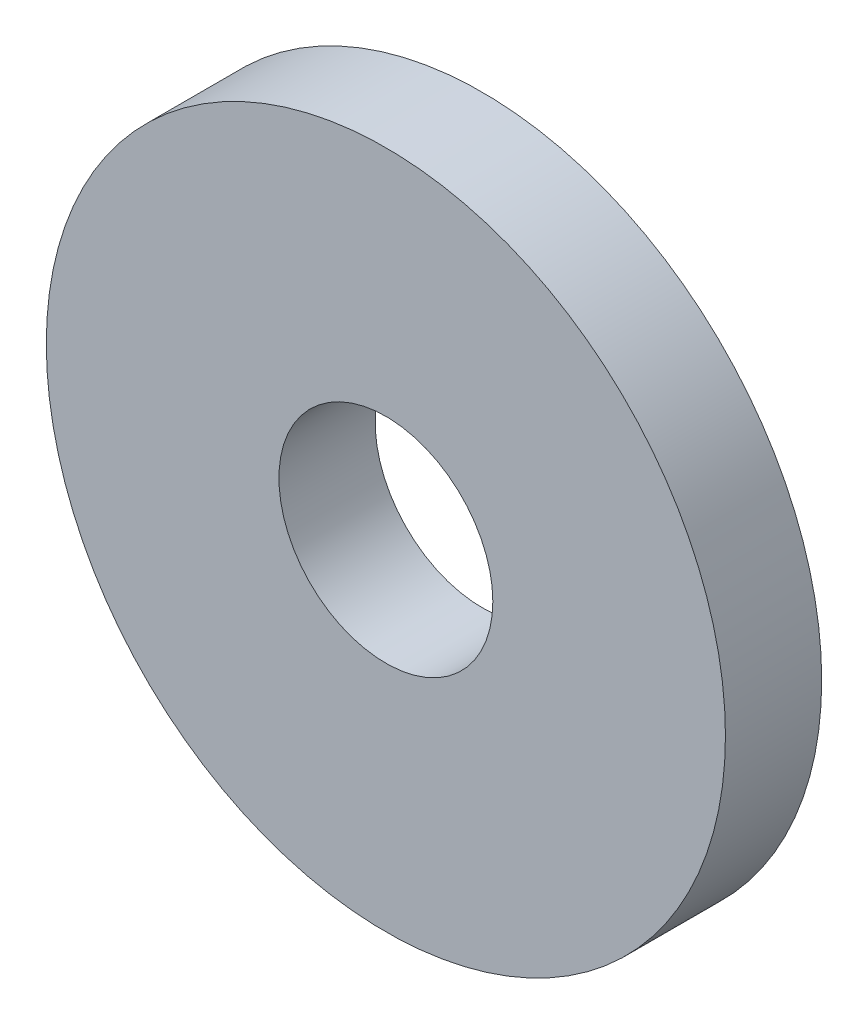
ISO-10303-21;
HEADER;
FILE_DESCRIPTION(('STEP AP214'),'2;1');
FILE_NAME('part.step','',(''),(''),'','','');
FILE_SCHEMA(('AUTOMOTIVE_DESIGN { 1 0 10303 214 1 1 1 1 }'));
ENDSEC;
DATA;
#1=APPLICATION_CONTEXT('core data for automotive mechanical design processes');
#2=APPLICATION_PROTOCOL_DEFINITION('international standard','automotive_design',2000,#1);
#3=PRODUCT_CONTEXT('',#1,'mechanical');
#4=PRODUCT('Part','Part','',(#3));
#5=PRODUCT_RELATED_PRODUCT_CATEGORY('part','',(#4));
#6=PRODUCT_DEFINITION_FORMATION('','',#4);
#7=PRODUCT_DEFINITION_CONTEXT('part definition',#1,'design');
#8=PRODUCT_DEFINITION('design','',#6,#7);
#9=PRODUCT_DEFINITION_SHAPE('','',#8);
#10=(LENGTH_UNIT() NAMED_UNIT(*) SI_UNIT(.MILLI.,.METRE.));
#11=(NAMED_UNIT(*) PLANE_ANGLE_UNIT() SI_UNIT($,.RADIAN.));
#12=(NAMED_UNIT(*) SI_UNIT($,.STERADIAN.) SOLID_ANGLE_UNIT());
#13=UNCERTAINTY_MEASURE_WITH_UNIT(LENGTH_MEASURE(1.E-05),#10,'distance_accuracy_value','');
#14=(GEOMETRIC_REPRESENTATION_CONTEXT(3) GLOBAL_UNCERTAINTY_ASSIGNED_CONTEXT((#13)) GLOBAL_UNIT_ASSIGNED_CONTEXT((#10,
#11,#12)) REPRESENTATION_CONTEXT('',''));
#15=CARTESIAN_POINT('',(0.,0.,0.));
#16=DIRECTION('',(0.,0.,1.));
#17=DIRECTION('',(1.,0.,0.));
#18=AXIS2_PLACEMENT_3D('',#15,#16,#17);
#19=CARTESIAN_POINT('',(0.,0.,2.25));
#20=DIRECTION('',(0.,0.,1.));
#21=DIRECTION('',(1.,0.,0.));
#22=AXIS2_PLACEMENT_3D('',#19,#20,#21);
#23=PLANE('',#22);
#24=CARTESIAN_POINT('',(0.,0.,2.25));
#25=DIRECTION('',(0.,0.,1.));
#26=DIRECTION('',(1.,0.,0.));
#27=AXIS2_PLACEMENT_3D('',#24,#25,#26);
#28=CIRCLE('',#27,15.875);
#29=CARTESIAN_POINT('',(15.875,0.,2.25));
#30=VERTEX_POINT('',#29);
#31=EDGE_CURVE('E10',#30,#30,#28,.T.);
#32=ORIENTED_EDGE('',*,*,#31,.T.);
#33=EDGE_LOOP('',(#32));
#34=FACE_BOUND('',#33,.T.);
#35=CARTESIAN_POINT('',(0.,0.,2.25));
#36=DIRECTION('',(0.,0.,1.));
#37=DIRECTION('',(1.,0.,0.));
#38=AXIS2_PLACEMENT_3D('',#35,#36,#37);
#39=CIRCLE('',#38,5.);
#40=CARTESIAN_POINT('',(5.,0.,2.25));
#41=VERTEX_POINT('',#40);
#42=EDGE_CURVE('E42',#41,#41,#39,.T.);
#43=ORIENTED_EDGE('',*,*,#42,.F.);
#44=EDGE_LOOP('',(#43));
#45=FACE_BOUND('',#44,.T.);
#46=ADVANCED_FACE('F31',(#34,#45),#23,.T.);
#47=CARTESIAN_POINT('',(0.,0.,-2.25));
#48=DIRECTION('',(0.,0.,1.));
#49=DIRECTION('',(1.,0.,0.));
#50=AXIS2_PLACEMENT_3D('',#47,#48,#49);
#51=PLANE('',#50);
#52=CARTESIAN_POINT('',(0.,0.,-2.25));
#53=DIRECTION('',(0.,0.,1.));
#54=DIRECTION('',(1.,0.,0.));
#55=AXIS2_PLACEMENT_3D('',#52,#53,#54);
#56=CIRCLE('',#55,15.875);
#57=CARTESIAN_POINT('',(15.875,0.,-2.25));
#58=VERTEX_POINT('',#57);
#59=EDGE_CURVE('E35',#58,#58,#56,.T.);
#60=ORIENTED_EDGE('',*,*,#59,.F.);
#61=EDGE_LOOP('',(#60));
#62=FACE_BOUND('',#61,.T.);
#63=CARTESIAN_POINT('',(0.,0.,-2.25));
#64=DIRECTION('',(0.,0.,1.));
#65=DIRECTION('',(1.,0.,0.));
#66=AXIS2_PLACEMENT_3D('',#63,#64,#65);
#67=CIRCLE('',#66,5.);
#68=CARTESIAN_POINT('',(5.,0.,-2.25));
#69=VERTEX_POINT('',#68);
#70=EDGE_CURVE('E44',#69,#69,#67,.T.);
#71=ORIENTED_EDGE('',*,*,#70,.T.);
#72=EDGE_LOOP('',(#71));
#73=FACE_BOUND('',#72,.T.);
#74=ADVANCED_FACE('F54',(#62,#73),#51,.F.);
#75=CARTESIAN_POINT('',(0.,0.,2.25));
#76=DIRECTION('',(0.,0.,-1.));
#77=DIRECTION('',(-1.,0.,0.));
#78=AXIS2_PLACEMENT_3D('',#75,#76,#77);
#79=CYLINDRICAL_SURFACE('',#78,15.875);
#80=ORIENTED_EDGE('',*,*,#31,.F.);
#81=EDGE_LOOP('',(#80));
#82=FACE_BOUND('',#81,.T.);
#83=ORIENTED_EDGE('',*,*,#59,.T.);
#84=EDGE_LOOP('',(#83));
#85=FACE_BOUND('',#84,.T.);
#86=ADVANCED_FACE('F33',(#82,#85),#79,.T.);
#87=CARTESIAN_POINT('',(0.,0.,2.25));
#88=DIRECTION('',(0.,0.,-1.));
#89=DIRECTION('',(-1.,0.,0.));
#90=AXIS2_PLACEMENT_3D('',#87,#88,#89);
#91=CYLINDRICAL_SURFACE('',#90,5.);
#92=ORIENTED_EDGE('',*,*,#42,.T.);
#93=EDGE_LOOP('',(#92));
#94=FACE_BOUND('',#93,.T.);
#95=ORIENTED_EDGE('',*,*,#70,.F.);
#96=EDGE_LOOP('',(#95));
#97=FACE_BOUND('',#96,.T.);
#98=ADVANCED_FACE('F50',(#94,#97),#91,.F.);
#99=CLOSED_SHELL('',(#46,#74,#86,#98));
#100=MANIFOLD_SOLID_BREP('B2',#99);
#101=ADVANCED_BREP_SHAPE_REPRESENTATION('',(#18,#100),#14);
#102=SHAPE_DEFINITION_REPRESENTATION(#9,#101);
ENDSEC;
END-ISO-10303-21;
